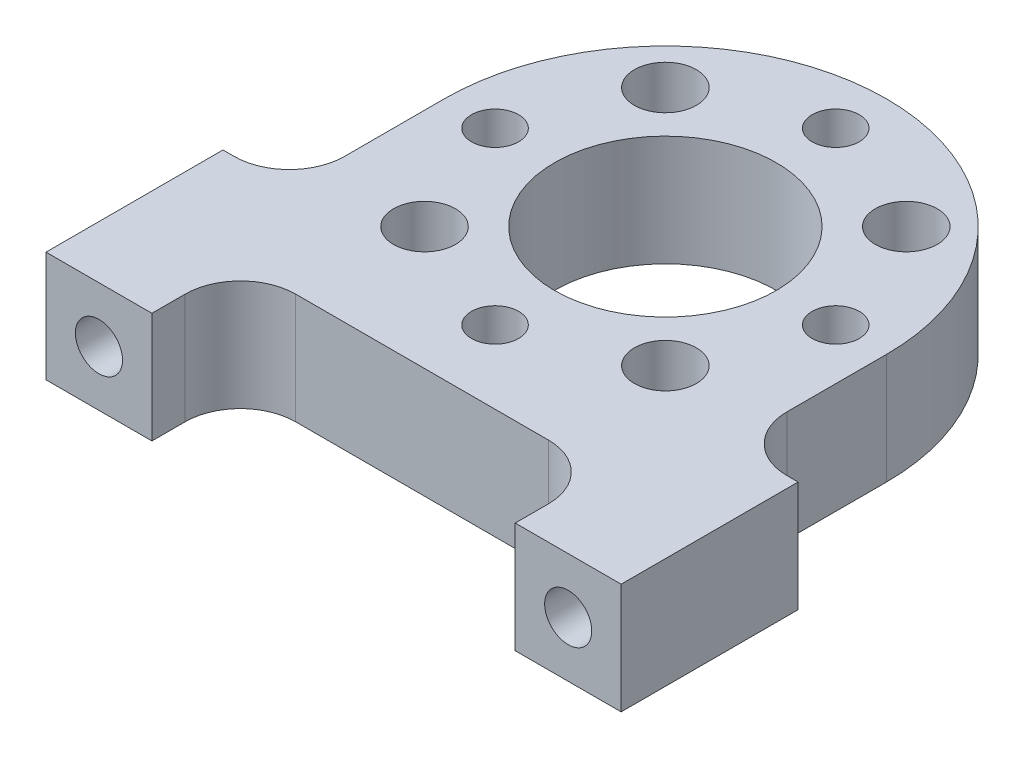
ISO-10303-21;
HEADER;
FILE_DESCRIPTION(('STEP AP214'),'2;1');
FILE_NAME('part.step','',(''),(''),'','','');
FILE_SCHEMA(('AUTOMOTIVE_DESIGN { 1 0 10303 214 1 1 1 1 }'));
ENDSEC;
DATA;
#1=APPLICATION_CONTEXT('core data for automotive mechanical design processes');
#2=APPLICATION_PROTOCOL_DEFINITION('international standard','automotive_design',2000,#1);
#3=PRODUCT_CONTEXT('',#1,'mechanical');
#4=PRODUCT('Part','Part','',(#3));
#5=PRODUCT_RELATED_PRODUCT_CATEGORY('part','',(#4));
#6=PRODUCT_DEFINITION_FORMATION('','',#4);
#7=PRODUCT_DEFINITION_CONTEXT('part definition',#1,'design');
#8=PRODUCT_DEFINITION('design','',#6,#7);
#9=PRODUCT_DEFINITION_SHAPE('','',#8);
#10=(LENGTH_UNIT() NAMED_UNIT(*) SI_UNIT(.MILLI.,.METRE.));
#11=(NAMED_UNIT(*) PLANE_ANGLE_UNIT() SI_UNIT($,.RADIAN.));
#12=(NAMED_UNIT(*) SI_UNIT($,.STERADIAN.) SOLID_ANGLE_UNIT());
#13=UNCERTAINTY_MEASURE_WITH_UNIT(LENGTH_MEASURE(1.E-05),#10,'distance_accuracy_value','');
#14=(GEOMETRIC_REPRESENTATION_CONTEXT(3) GLOBAL_UNCERTAINTY_ASSIGNED_CONTEXT((#13)) GLOBAL_UNIT_ASSIGNED_CONTEXT((#10,
#11,#12)) REPRESENTATION_CONTEXT('',''));
#15=CARTESIAN_POINT('',(0.,0.,0.));
#16=DIRECTION('',(0.,0.,1.));
#17=DIRECTION('',(1.,0.,0.));
#18=AXIS2_PLACEMENT_3D('',#15,#16,#17);
#19=CARTESIAN_POINT('',(-13.4703841816038,3.175,11.429999999848));
#20=DIRECTION('',(0.,0.,1.));
#21=DIRECTION('',(1.,0.,0.));
#22=AXIS2_PLACEMENT_3D('',#19,#20,#21);
#23=CONICAL_SURFACE('',#22,1.35254999978154,1.02974425854162);
#24=CARTESIAN_POINT('',(-13.4703841818293,3.175,10.6173059696459));
#25=VERTEX_POINT('',#24);
#26=VERTEX_LOOP('',#25);
#27=FACE_BOUND('',#26,.T.);
#28=CARTESIAN_POINT('',(-13.4703841816038,3.175,11.43));
#29=DIRECTION('',(0.,0.,1.));
#30=DIRECTION('',(1.,0.,0.));
#31=AXIS2_PLACEMENT_3D('',#28,#29,#30);
#32=CIRCLE('',#31,1.35254999999999);
#33=CARTESIAN_POINT('',(-12.1178341816038,3.175,11.43));
#34=VERTEX_POINT('',#33);
#35=EDGE_CURVE('E250',#34,#34,#32,.T.);
#36=ORIENTED_EDGE('',*,*,#35,.T.);
#37=EDGE_LOOP('',(#36));
#38=FACE_BOUND('',#37,.T.);
#39=ADVANCED_FACE('F26',(#27,#38),#23,.F.);
#40=CARTESIAN_POINT('',(13.4703841816036,3.175,11.4299999999616));
#41=DIRECTION('',(0.,0.,1.));
#42=DIRECTION('',(1.,0.,0.));
#43=AXIS2_PLACEMENT_3D('',#40,#41,#42);
#44=CONICAL_SURFACE('',#43,1.35254999977809,1.02974425839107);
#45=CARTESIAN_POINT('',(13.4703841813462,3.175,10.6173059697028));
#46=VERTEX_POINT('',#45);
#47=VERTEX_LOOP('',#46);
#48=FACE_BOUND('',#47,.T.);
#49=CARTESIAN_POINT('',(13.4703841816036,3.175,11.43));
#50=DIRECTION('',(0.,0.,1.));
#51=DIRECTION('',(1.,0.,0.));
#52=AXIS2_PLACEMENT_3D('',#49,#50,#51);
#53=CIRCLE('',#52,1.35254999999999);
#54=CARTESIAN_POINT('',(14.8229341816036,3.175,11.43));
#55=VERTEX_POINT('',#54);
#56=EDGE_CURVE('E235',#55,#55,#53,.T.);
#57=ORIENTED_EDGE('',*,*,#56,.T.);
#58=EDGE_LOOP('',(#57));
#59=FACE_BOUND('',#58,.T.);
#60=ADVANCED_FACE('F630',(#48,#59),#44,.F.);
#61=CARTESIAN_POINT('',(0.,-38.1211607903012,8.89));
#62=DIRECTION('',(0.,0.,-1.));
#63=DIRECTION('',(-1.,0.,0.));
#64=AXIS2_PLACEMENT_3D('',#61,#62,#63);
#65=PLANE('',#64);
#66=DIRECTION('',(1.,0.,0.));
#67=VECTOR('',#66,1.);
#68=CARTESIAN_POINT('',(0.,0.,8.89));
#69=LINE('',#68,#67);
#70=CARTESIAN_POINT('',(-15.875,0.,8.89));
#71=VERTEX_POINT('',#70);
#72=CARTESIAN_POINT('',(-16.51,0.,8.89));
#73=VERTEX_POINT('',#72);
#74=EDGE_CURVE('E231',#71,#73,#69,.F.);
#75=ORIENTED_EDGE('',*,*,#74,.T.);
#76=DIRECTION('',(0.,1.,0.));
#77=VECTOR('',#76,1.);
#78=CARTESIAN_POINT('',(-16.51,-38.1211607903012,8.89));
#79=LINE('',#78,#77);
#80=CARTESIAN_POINT('',(-16.51,6.35,8.89));
#81=VERTEX_POINT('',#80);
#82=EDGE_CURVE('E212',#81,#73,#79,.F.);
#83=ORIENTED_EDGE('',*,*,#82,.F.);
#84=DIRECTION('',(-1.,0.,0.));
#85=VECTOR('',#84,1.);
#86=CARTESIAN_POINT('',(0.,6.35,8.89));
#87=LINE('',#86,#85);
#88=CARTESIAN_POINT('',(-15.875,6.35,8.89));
#89=VERTEX_POINT('',#88);
#90=EDGE_CURVE('E248',#81,#89,#87,.F.);
#91=ORIENTED_EDGE('',*,*,#90,.T.);
#92=DIRECTION('',(0.,-1.,0.));
#93=VECTOR('',#92,1.);
#94=CARTESIAN_POINT('',(-15.875,-38.1211607903012,8.89));
#95=LINE('',#94,#93);
#96=EDGE_CURVE('E219',#89,#71,#95,.T.);
#97=ORIENTED_EDGE('',*,*,#96,.T.);
#98=EDGE_LOOP('',(#75,#83,#91,#97));
#99=FACE_BOUND('',#98,.T.);
#100=ADVANCED_FACE('F621',(#99),#65,.T.);
#101=CARTESIAN_POINT('',(-13.4703841816038,3.175,19.05));
#102=DIRECTION('',(0.,0.,1.));
#103=DIRECTION('',(1.,0.,0.));
#104=AXIS2_PLACEMENT_3D('',#101,#102,#103);
#105=CYLINDRICAL_SURFACE('',#104,1.35254999999999);
#106=CARTESIAN_POINT('',(-13.4703841816038,3.175,19.05));
#107=DIRECTION('',(0.,0.,1.));
#108=DIRECTION('',(1.,0.,0.));
#109=AXIS2_PLACEMENT_3D('',#106,#107,#108);
#110=CIRCLE('',#109,1.35254999999999);
#111=CARTESIAN_POINT('',(-12.1178341816038,3.175,19.05));
#112=VERTEX_POINT('',#111);
#113=EDGE_CURVE('E215',#112,#112,#110,.F.);
#114=ORIENTED_EDGE('',*,*,#113,.F.);
#115=EDGE_LOOP('',(#114));
#116=FACE_BOUND('',#115,.T.);
#117=ORIENTED_EDGE('',*,*,#35,.F.);
#118=EDGE_LOOP('',(#117));
#119=FACE_BOUND('',#118,.T.);
#120=ADVANCED_FACE('F612',(#116,#119),#105,.F.);
#121=CARTESIAN_POINT('',(13.4703841816036,3.175,19.05));
#122=DIRECTION('',(0.,0.,1.));
#123=DIRECTION('',(1.,0.,0.));
#124=AXIS2_PLACEMENT_3D('',#121,#122,#123);
#125=CYLINDRICAL_SURFACE('',#124,1.35254999999999);
#126=CARTESIAN_POINT('',(13.4703841816036,3.175,19.05));
#127=DIRECTION('',(0.,0.,1.));
#128=DIRECTION('',(1.,0.,0.));
#129=AXIS2_PLACEMENT_3D('',#126,#127,#128);
#130=CIRCLE('',#129,1.35254999999999);
#131=CARTESIAN_POINT('',(14.8229341816036,3.175,19.05));
#132=VERTEX_POINT('',#131);
#133=EDGE_CURVE('E239',#132,#132,#130,.F.);
#134=ORIENTED_EDGE('',*,*,#133,.F.);
#135=EDGE_LOOP('',(#134));
#136=FACE_BOUND('',#135,.T.);
#137=ORIENTED_EDGE('',*,*,#56,.F.);
#138=EDGE_LOOP('',(#137));
#139=FACE_BOUND('',#138,.T.);
#140=ADVANCED_FACE('F603',(#136,#139),#125,.F.);
#141=CARTESIAN_POINT('',(0.,-38.1211607903012,8.89));
#142=DIRECTION('',(0.,0.,-1.));
#143=DIRECTION('',(-1.,0.,0.));
#144=AXIS2_PLACEMENT_3D('',#141,#142,#143);
#145=PLANE('',#144);
#146=DIRECTION('',(-1.,0.,0.));
#147=VECTOR('',#146,1.);
#148=CARTESIAN_POINT('',(0.,6.35,8.89));
#149=LINE('',#148,#147);
#150=CARTESIAN_POINT('',(15.875,6.35,8.89));
#151=VERTEX_POINT('',#150);
#152=CARTESIAN_POINT('',(16.51,6.35,8.89));
#153=VERTEX_POINT('',#152);
#154=EDGE_CURVE('E233',#151,#153,#149,.F.);
#155=ORIENTED_EDGE('',*,*,#154,.T.);
#156=DIRECTION('',(0.,1.,0.));
#157=VECTOR('',#156,1.);
#158=CARTESIAN_POINT('',(16.51,-38.1211607903012,8.89));
#159=LINE('',#158,#157);
#160=CARTESIAN_POINT('',(16.51,0.,8.89));
#161=VERTEX_POINT('',#160);
#162=EDGE_CURVE('E161',#161,#153,#159,.T.);
#163=ORIENTED_EDGE('',*,*,#162,.F.);
#164=DIRECTION('',(1.,0.,0.));
#165=VECTOR('',#164,1.);
#166=CARTESIAN_POINT('',(0.,0.,8.89));
#167=LINE('',#166,#165);
#168=CARTESIAN_POINT('',(15.875,0.,8.89));
#169=VERTEX_POINT('',#168);
#170=EDGE_CURVE('E229',#161,#169,#167,.F.);
#171=ORIENTED_EDGE('',*,*,#170,.T.);
#172=DIRECTION('',(0.,-1.,0.));
#173=VECTOR('',#172,1.);
#174=CARTESIAN_POINT('',(15.875,-38.1211607903012,8.89));
#175=LINE('',#174,#173);
#176=EDGE_CURVE('E160',#169,#151,#175,.F.);
#177=ORIENTED_EDGE('',*,*,#176,.T.);
#178=EDGE_LOOP('',(#155,#163,#171,#177));
#179=FACE_BOUND('',#178,.T.);
#180=ADVANCED_FACE('F351',(#179),#145,.T.);
#181=CARTESIAN_POINT('',(0.,0.,0.));
#182=DIRECTION('',(0.,1.,0.));
#183=DIRECTION('',(0.,0.,1.));
#184=AXIS2_PLACEMENT_3D('',#181,#182,#183);
#185=PLANE('',#184);
#186=DIRECTION('',(0.,0.,-1.));
#187=VECTOR('',#186,1.);
#188=CARTESIAN_POINT('',(12.7,0.,0.));
#189=LINE('',#188,#187);
#190=CARTESIAN_POINT('',(12.7,0.,5.715));
#191=VERTEX_POINT('',#190);
#192=CARTESIAN_POINT('',(12.7,0.,0.));
#193=VERTEX_POINT('',#192);
#194=EDGE_CURVE('E225',#191,#193,#189,.T.);
#195=ORIENTED_EDGE('',*,*,#194,.F.);
#196=CARTESIAN_POINT('',(15.875,0.,5.715));
#197=DIRECTION('',(0.,-1.,0.));
#198=DIRECTION('',(0.,0.,-1.));
#199=AXIS2_PLACEMENT_3D('',#196,#197,#198);
#200=CIRCLE('',#199,3.175);
#201=EDGE_CURVE('E296',#191,#169,#200,.F.);
#202=ORIENTED_EDGE('',*,*,#201,.T.);
#203=ORIENTED_EDGE('',*,*,#170,.F.);
#204=DIRECTION('',(0.,0.,-1.));
#205=VECTOR('',#204,1.);
#206=CARTESIAN_POINT('',(16.51,0.,0.));
#207=LINE('',#206,#205);
#208=CARTESIAN_POINT('',(16.51,0.,19.05));
#209=VERTEX_POINT('',#208);
#210=EDGE_CURVE('E185',#209,#161,#207,.T.);
#211=ORIENTED_EDGE('',*,*,#210,.F.);
#212=DIRECTION('',(1.,0.,0.));
#213=VECTOR('',#212,1.);
#214=CARTESIAN_POINT('',(0.,0.,19.05));
#215=LINE('',#214,#213);
#216=CARTESIAN_POINT('',(10.42924,0.,19.05));
#217=VERTEX_POINT('',#216);
#218=EDGE_CURVE('E157',#217,#209,#215,.T.);
#219=ORIENTED_EDGE('',*,*,#218,.F.);
#220=DIRECTION('',(0.,0.,1.));
#221=VECTOR('',#220,1.);
#222=CARTESIAN_POINT('',(10.42924,0.,0.));
#223=LINE('',#222,#221);
#224=CARTESIAN_POINT('',(10.42924,0.,17.145));
#225=VERTEX_POINT('',#224);
#226=EDGE_CURVE('E236',#225,#217,#223,.T.);
#227=ORIENTED_EDGE('',*,*,#226,.F.);
#228=CARTESIAN_POINT('',(7.25424,0.,17.145));
#229=DIRECTION('',(0.,-1.,0.));
#230=DIRECTION('',(0.,0.,-1.));
#231=AXIS2_PLACEMENT_3D('',#228,#229,#230);
#232=CIRCLE('',#231,3.175);
#233=CARTESIAN_POINT('',(7.25424,0.,13.97));
#234=VERTEX_POINT('',#233);
#235=EDGE_CURVE('E188',#225,#234,#232,.F.);
#236=ORIENTED_EDGE('',*,*,#235,.T.);
#237=DIRECTION('',(1.,0.,0.));
#238=VECTOR('',#237,1.);
#239=CARTESIAN_POINT('',(0.,0.,13.97));
#240=LINE('',#239,#238);
#241=CARTESIAN_POINT('',(-7.25424,0.,13.97));
#242=VERTEX_POINT('',#241);
#243=EDGE_CURVE('E192',#242,#234,#240,.T.);
#244=ORIENTED_EDGE('',*,*,#243,.F.);
#245=CARTESIAN_POINT('',(-7.25424,0.,17.145));
#246=DIRECTION('',(0.,-1.,0.));
#247=DIRECTION('',(0.,0.,-1.));
#248=AXIS2_PLACEMENT_3D('',#245,#246,#247);
#249=CIRCLE('',#248,3.175);
#250=CARTESIAN_POINT('',(-10.42924,0.,17.145));
#251=VERTEX_POINT('',#250);
#252=EDGE_CURVE('E195',#242,#251,#249,.F.);
#253=ORIENTED_EDGE('',*,*,#252,.T.);
#254=DIRECTION('',(0.,0.,-1.));
#255=VECTOR('',#254,1.);
#256=CARTESIAN_POINT('',(-10.42924,0.,0.));
#257=LINE('',#256,#255);
#258=CARTESIAN_POINT('',(-10.42924,0.,19.05));
#259=VERTEX_POINT('',#258);
#260=EDGE_CURVE('E199',#259,#251,#257,.T.);
#261=ORIENTED_EDGE('',*,*,#260,.F.);
#262=DIRECTION('',(1.,0.,0.));
#263=VECTOR('',#262,1.);
#264=CARTESIAN_POINT('',(0.,0.,19.05));
#265=LINE('',#264,#263);
#266=CARTESIAN_POINT('',(-16.51,0.,19.05));
#267=VERTEX_POINT('',#266);
#268=EDGE_CURVE('E208',#267,#259,#265,.T.);
#269=ORIENTED_EDGE('',*,*,#268,.F.);
#270=DIRECTION('',(0.,0.,1.));
#271=VECTOR('',#270,1.);
#272=CARTESIAN_POINT('',(-16.51,0.,0.));
#273=LINE('',#272,#271);
#274=EDGE_CURVE('E216',#73,#267,#273,.T.);
#275=ORIENTED_EDGE('',*,*,#274,.F.);
#276=ORIENTED_EDGE('',*,*,#74,.F.);
#277=CARTESIAN_POINT('',(-15.875,0.,5.715));
#278=DIRECTION('',(0.,-1.,0.));
#279=DIRECTION('',(0.,0.,-1.));
#280=AXIS2_PLACEMENT_3D('',#277,#278,#279);
#281=CIRCLE('',#280,3.175);
#282=CARTESIAN_POINT('',(-12.7,0.,5.715));
#283=VERTEX_POINT('',#282);
#284=EDGE_CURVE('E222',#71,#283,#281,.F.);
#285=ORIENTED_EDGE('',*,*,#284,.T.);
#286=DIRECTION('',(0.,0.,1.));
#287=VECTOR('',#286,1.);
#288=CARTESIAN_POINT('',(-12.7,0.,0.));
#289=LINE('',#288,#287);
#290=CARTESIAN_POINT('',(-12.7,0.,0.));
#291=VERTEX_POINT('',#290);
#292=EDGE_CURVE('E110',#291,#283,#289,.T.);
#293=ORIENTED_EDGE('',*,*,#292,.F.);
#294=CARTESIAN_POINT('',(0.,0.,0.));
#295=DIRECTION('',(0.,-1.,0.));
#296=DIRECTION('',(0.,0.,-1.));
#297=AXIS2_PLACEMENT_3D('',#294,#295,#296);
#298=CIRCLE('',#297,12.7);
#299=EDGE_CURVE('E252',#193,#291,#298,.F.);
#300=ORIENTED_EDGE('',*,*,#299,.F.);
#301=EDGE_LOOP('',(#195,#202,#203,#211,#219,#227,#236,#244,#253,#261,#269,#275,#276,#285,#293,#300));
#302=FACE_BOUND('',#301,.T.);
#303=CARTESIAN_POINT('',(0.,0.,0.));
#304=DIRECTION('',(0.,1.,0.));
#305=DIRECTION('',(0.,0.,1.));
#306=AXIS2_PLACEMENT_3D('',#303,#304,#305);
#307=CIRCLE('',#306,6.3627);
#308=CARTESIAN_POINT('',(0.,0.,6.3627));
#309=VERTEX_POINT('',#308);
#310=EDGE_CURVE('E309',#309,#309,#307,.T.);
#311=ORIENTED_EDGE('',*,*,#310,.T.);
#312=EDGE_LOOP('',(#311));
#313=FACE_BOUND('',#312,.T.);
#314=CARTESIAN_POINT('',(9.779,0.,0.));
#315=DIRECTION('',(0.,1.,0.));
#316=DIRECTION('',(0.,0.,1.));
#317=AXIS2_PLACEMENT_3D('',#314,#315,#316);
#318=CIRCLE('',#317,1.35254999999999);
#319=CARTESIAN_POINT('',(9.779,0.,1.35254999999999));
#320=VERTEX_POINT('',#319);
#321=EDGE_CURVE('E312',#320,#320,#318,.T.);
#322=ORIENTED_EDGE('',*,*,#321,.T.);
#323=EDGE_LOOP('',(#322));
#324=FACE_BOUND('',#323,.T.);
#325=CARTESIAN_POINT('',(0.,0.,-9.779));
#326=DIRECTION('',(0.,1.,0.));
#327=DIRECTION('',(0.,0.,1.));
#328=AXIS2_PLACEMENT_3D('',#325,#326,#327);
#329=CIRCLE('',#328,1.35254999999999);
#330=CARTESIAN_POINT('',(0.,0.,-8.42645000000001));
#331=VERTEX_POINT('',#330);
#332=EDGE_CURVE('E315',#331,#331,#329,.T.);
#333=ORIENTED_EDGE('',*,*,#332,.T.);
#334=EDGE_LOOP('',(#333));
#335=FACE_BOUND('',#334,.T.);
#336=CARTESIAN_POINT('',(-9.779,0.,0.));
#337=DIRECTION('',(0.,1.,0.));
#338=DIRECTION('',(0.,0.,1.));
#339=AXIS2_PLACEMENT_3D('',#336,#337,#338);
#340=CIRCLE('',#339,1.35254999999999);
#341=CARTESIAN_POINT('',(-9.779,0.,1.35254999999999));
#342=VERTEX_POINT('',#341);
#343=EDGE_CURVE('E318',#342,#342,#340,.T.);
#344=ORIENTED_EDGE('',*,*,#343,.T.);
#345=EDGE_LOOP('',(#344));
#346=FACE_BOUND('',#345,.T.);
#347=CARTESIAN_POINT('',(1.02429588037641E-13,0.,9.779));
#348=DIRECTION('',(0.,1.,0.));
#349=DIRECTION('',(0.,0.,1.));
#350=AXIS2_PLACEMENT_3D('',#347,#348,#349);
#351=CIRCLE('',#350,1.35254999999999);
#352=CARTESIAN_POINT('',(1.02429588037641E-13,0.,11.13155));
#353=VERTEX_POINT('',#352);
#354=EDGE_CURVE('E321',#353,#353,#351,.T.);
#355=ORIENTED_EDGE('',*,*,#354,.T.);
#356=EDGE_LOOP('',(#355));
#357=FACE_BOUND('',#356,.T.);
#358=CARTESIAN_POINT('',(6.91479721322319,0.,-6.9147972132233));
#359=DIRECTION('',(0.,1.,0.));
#360=DIRECTION('',(0.,0.,1.));
#361=AXIS2_PLACEMENT_3D('',#358,#359,#360);
#362=CIRCLE('',#361,1.778);
#363=CARTESIAN_POINT('',(6.91479721322319,0.,-5.1367972132233));
#364=VERTEX_POINT('',#363);
#365=EDGE_CURVE('E324',#364,#364,#362,.T.);
#366=ORIENTED_EDGE('',*,*,#365,.T.);
#367=EDGE_LOOP('',(#366));
#368=FACE_BOUND('',#367,.T.);
#369=CARTESIAN_POINT('',(-6.91479721322332,0.,-6.91479721322317));
#370=DIRECTION('',(0.,1.,0.));
#371=DIRECTION('',(0.,0.,1.));
#372=AXIS2_PLACEMENT_3D('',#369,#370,#371);
#373=CIRCLE('',#372,1.778);
#374=CARTESIAN_POINT('',(-6.91479721322332,0.,-5.13679721322317));
#375=VERTEX_POINT('',#374);
#376=EDGE_CURVE('E327',#375,#375,#373,.T.);
#377=ORIENTED_EDGE('',*,*,#376,.T.);
#378=EDGE_LOOP('',(#377));
#379=FACE_BOUND('',#378,.T.);
#380=CARTESIAN_POINT('',(-6.91479721322319,0.,6.9147972132233));
#381=DIRECTION('',(0.,1.,0.));
#382=DIRECTION('',(0.,0.,1.));
#383=AXIS2_PLACEMENT_3D('',#380,#381,#382);
#384=CIRCLE('',#383,1.778);
#385=CARTESIAN_POINT('',(-6.91479721322319,0.,8.6927972132233));
#386=VERTEX_POINT('',#385);
#387=EDGE_CURVE('E329',#386,#386,#384,.T.);
#388=ORIENTED_EDGE('',*,*,#387,.T.);
#389=EDGE_LOOP('',(#388));
#390=FACE_BOUND('',#389,.T.);
#391=CARTESIAN_POINT('',(6.91479721322337,0.,6.91479721322312));
#392=DIRECTION('',(0.,1.,0.));
#393=DIRECTION('',(0.,0.,1.));
#394=AXIS2_PLACEMENT_3D('',#391,#392,#393);
#395=CIRCLE('',#394,1.778);
#396=CARTESIAN_POINT('',(6.91479721322337,0.,8.69279721322311));
#397=VERTEX_POINT('',#396);
#398=EDGE_CURVE('E29',#397,#397,#395,.T.);
#399=ORIENTED_EDGE('',*,*,#398,.T.);
#400=EDGE_LOOP('',(#399));
#401=FACE_BOUND('',#400,.T.);
#402=ADVANCED_FACE('F336',(#302,#313,#324,#335,#346,#357,#368,#379,#390,#401),#185,.F.);
#403=CARTESIAN_POINT('',(6.91479721322337,6.35,6.91479721322312));
#404=DIRECTION('',(0.,1.,0.));
#405=DIRECTION('',(0.,0.,1.));
#406=AXIS2_PLACEMENT_3D('',#403,#404,#405);
#407=CYLINDRICAL_SURFACE('',#406,1.778);
#408=CARTESIAN_POINT('',(6.91479721322337,6.35,6.91479721322312));
#409=DIRECTION('',(0.,1.,0.));
#410=DIRECTION('',(0.,0.,1.));
#411=AXIS2_PLACEMENT_3D('',#408,#409,#410);
#412=CIRCLE('',#411,1.778);
#413=CARTESIAN_POINT('',(6.91479721322337,6.35,8.69279721322311));
#414=VERTEX_POINT('',#413);
#415=EDGE_CURVE('E293',#414,#414,#412,.F.);
#416=ORIENTED_EDGE('',*,*,#415,.F.);
#417=EDGE_LOOP('',(#416));
#418=FACE_BOUND('',#417,.T.);
#419=ORIENTED_EDGE('',*,*,#398,.F.);
#420=EDGE_LOOP('',(#419));
#421=FACE_BOUND('',#420,.T.);
#422=ADVANCED_FACE('F338',(#418,#421),#407,.F.);
#423=CARTESIAN_POINT('',(-6.91479721322319,6.35,6.9147972132233));
#424=DIRECTION('',(0.,1.,0.));
#425=DIRECTION('',(0.,0.,1.));
#426=AXIS2_PLACEMENT_3D('',#423,#424,#425);
#427=CYLINDRICAL_SURFACE('',#426,1.778);
#428=CARTESIAN_POINT('',(-6.91479721322319,6.35,6.9147972132233));
#429=DIRECTION('',(0.,1.,0.));
#430=DIRECTION('',(0.,0.,1.));
#431=AXIS2_PLACEMENT_3D('',#428,#429,#430);
#432=CIRCLE('',#431,1.778);
#433=CARTESIAN_POINT('',(-6.91479721322319,6.35,8.6927972132233));
#434=VERTEX_POINT('',#433);
#435=EDGE_CURVE('E290',#434,#434,#432,.F.);
#436=ORIENTED_EDGE('',*,*,#435,.F.);
#437=EDGE_LOOP('',(#436));
#438=FACE_BOUND('',#437,.T.);
#439=ORIENTED_EDGE('',*,*,#387,.F.);
#440=EDGE_LOOP('',(#439));
#441=FACE_BOUND('',#440,.T.);
#442=ADVANCED_FACE('F340',(#438,#441),#427,.F.);
#443=CARTESIAN_POINT('',(-6.91479721322332,6.35,-6.91479721322317));
#444=DIRECTION('',(0.,1.,0.));
#445=DIRECTION('',(0.,0.,1.));
#446=AXIS2_PLACEMENT_3D('',#443,#444,#445);
#447=CYLINDRICAL_SURFACE('',#446,1.778);
#448=CARTESIAN_POINT('',(-6.91479721322332,6.35,-6.91479721322317));
#449=DIRECTION('',(0.,1.,0.));
#450=DIRECTION('',(0.,0.,1.));
#451=AXIS2_PLACEMENT_3D('',#448,#449,#450);
#452=CIRCLE('',#451,1.778);
#453=CARTESIAN_POINT('',(-6.91479721322332,6.35,-5.13679721322317));
#454=VERTEX_POINT('',#453);
#455=EDGE_CURVE('E287',#454,#454,#452,.F.);
#456=ORIENTED_EDGE('',*,*,#455,.F.);
#457=EDGE_LOOP('',(#456));
#458=FACE_BOUND('',#457,.T.);
#459=ORIENTED_EDGE('',*,*,#376,.F.);
#460=EDGE_LOOP('',(#459));
#461=FACE_BOUND('',#460,.T.);
#462=ADVANCED_FACE('F348',(#458,#461),#447,.F.);
#463=CARTESIAN_POINT('',(6.91479721322319,6.35,-6.9147972132233));
#464=DIRECTION('',(0.,1.,0.));
#465=DIRECTION('',(0.,0.,1.));
#466=AXIS2_PLACEMENT_3D('',#463,#464,#465);
#467=CYLINDRICAL_SURFACE('',#466,1.778);
#468=CARTESIAN_POINT('',(6.91479721322319,6.35,-6.9147972132233));
#469=DIRECTION('',(0.,1.,0.));
#470=DIRECTION('',(0.,0.,1.));
#471=AXIS2_PLACEMENT_3D('',#468,#469,#470);
#472=CIRCLE('',#471,1.778);
#473=CARTESIAN_POINT('',(6.91479721322319,6.35,-5.1367972132233));
#474=VERTEX_POINT('',#473);
#475=EDGE_CURVE('E284',#474,#474,#472,.F.);
#476=ORIENTED_EDGE('',*,*,#475,.F.);
#477=EDGE_LOOP('',(#476));
#478=FACE_BOUND('',#477,.T.);
#479=ORIENTED_EDGE('',*,*,#365,.F.);
#480=EDGE_LOOP('',(#479));
#481=FACE_BOUND('',#480,.T.);
#482=ADVANCED_FACE('F429',(#478,#481),#467,.F.);
#483=CARTESIAN_POINT('',(1.02429588037641E-13,6.35,9.779));
#484=DIRECTION('',(0.,1.,0.));
#485=DIRECTION('',(0.,0.,1.));
#486=AXIS2_PLACEMENT_3D('',#483,#484,#485);
#487=CYLINDRICAL_SURFACE('',#486,1.35254999999999);
#488=CARTESIAN_POINT('',(1.02429588037641E-13,6.35,9.779));
#489=DIRECTION('',(0.,1.,0.));
#490=DIRECTION('',(0.,0.,1.));
#491=AXIS2_PLACEMENT_3D('',#488,#489,#490);
#492=CIRCLE('',#491,1.35254999999999);
#493=CARTESIAN_POINT('',(1.02429588037641E-13,6.35,11.13155));
#494=VERTEX_POINT('',#493);
#495=EDGE_CURVE('E281',#494,#494,#492,.F.);
#496=ORIENTED_EDGE('',*,*,#495,.F.);
#497=EDGE_LOOP('',(#496));
#498=FACE_BOUND('',#497,.T.);
#499=ORIENTED_EDGE('',*,*,#354,.F.);
#500=EDGE_LOOP('',(#499));
#501=FACE_BOUND('',#500,.T.);
#502=ADVANCED_FACE('F425',(#498,#501),#487,.F.);
#503=CARTESIAN_POINT('',(-9.779,6.35,0.));
#504=DIRECTION('',(0.,1.,0.));
#505=DIRECTION('',(0.,0.,1.));
#506=AXIS2_PLACEMENT_3D('',#503,#504,#505);
#507=CYLINDRICAL_SURFACE('',#506,1.35254999999999);
#508=CARTESIAN_POINT('',(-9.779,6.35,0.));
#509=DIRECTION('',(0.,1.,0.));
#510=DIRECTION('',(0.,0.,1.));
#511=AXIS2_PLACEMENT_3D('',#508,#509,#510);
#512=CIRCLE('',#511,1.35254999999999);
#513=CARTESIAN_POINT('',(-9.779,6.35,1.35254999999999));
#514=VERTEX_POINT('',#513);
#515=EDGE_CURVE('E278',#514,#514,#512,.F.);
#516=ORIENTED_EDGE('',*,*,#515,.F.);
#517=EDGE_LOOP('',(#516));
#518=FACE_BOUND('',#517,.T.);
#519=ORIENTED_EDGE('',*,*,#343,.F.);
#520=EDGE_LOOP('',(#519));
#521=FACE_BOUND('',#520,.T.);
#522=ADVANCED_FACE('F421',(#518,#521),#507,.F.);
#523=CARTESIAN_POINT('',(0.,6.35,-9.779));
#524=DIRECTION('',(0.,1.,0.));
#525=DIRECTION('',(0.,0.,1.));
#526=AXIS2_PLACEMENT_3D('',#523,#524,#525);
#527=CYLINDRICAL_SURFACE('',#526,1.35254999999999);
#528=CARTESIAN_POINT('',(0.,6.35,-9.779));
#529=DIRECTION('',(0.,1.,0.));
#530=DIRECTION('',(0.,0.,1.));
#531=AXIS2_PLACEMENT_3D('',#528,#529,#530);
#532=CIRCLE('',#531,1.35254999999999);
#533=CARTESIAN_POINT('',(0.,6.35,-8.42645000000001));
#534=VERTEX_POINT('',#533);
#535=EDGE_CURVE('E275',#534,#534,#532,.F.);
#536=ORIENTED_EDGE('',*,*,#535,.F.);
#537=EDGE_LOOP('',(#536));
#538=FACE_BOUND('',#537,.T.);
#539=ORIENTED_EDGE('',*,*,#332,.F.);
#540=EDGE_LOOP('',(#539));
#541=FACE_BOUND('',#540,.T.);
#542=ADVANCED_FACE('F417',(#538,#541),#527,.F.);
#543=CARTESIAN_POINT('',(9.779,6.35,0.));
#544=DIRECTION('',(0.,1.,0.));
#545=DIRECTION('',(0.,0.,1.));
#546=AXIS2_PLACEMENT_3D('',#543,#544,#545);
#547=CYLINDRICAL_SURFACE('',#546,1.35254999999999);
#548=CARTESIAN_POINT('',(9.779,6.35,0.));
#549=DIRECTION('',(0.,1.,0.));
#550=DIRECTION('',(0.,0.,1.));
#551=AXIS2_PLACEMENT_3D('',#548,#549,#550);
#552=CIRCLE('',#551,1.35254999999999);
#553=CARTESIAN_POINT('',(9.779,6.35,1.35254999999999));
#554=VERTEX_POINT('',#553);
#555=EDGE_CURVE('E272',#554,#554,#552,.F.);
#556=ORIENTED_EDGE('',*,*,#555,.F.);
#557=EDGE_LOOP('',(#556));
#558=FACE_BOUND('',#557,.T.);
#559=ORIENTED_EDGE('',*,*,#321,.F.);
#560=EDGE_LOOP('',(#559));
#561=FACE_BOUND('',#560,.T.);
#562=ADVANCED_FACE('F413',(#558,#561),#547,.F.);
#563=CARTESIAN_POINT('',(0.,6.35,0.));
#564=DIRECTION('',(0.,1.,0.));
#565=DIRECTION('',(0.,0.,1.));
#566=AXIS2_PLACEMENT_3D('',#563,#564,#565);
#567=CYLINDRICAL_SURFACE('',#566,6.3627);
#568=CARTESIAN_POINT('',(0.,6.35,0.));
#569=DIRECTION('',(0.,1.,0.));
#570=DIRECTION('',(0.,0.,1.));
#571=AXIS2_PLACEMENT_3D('',#568,#569,#570);
#572=CIRCLE('',#571,6.3627);
#573=CARTESIAN_POINT('',(0.,6.35,6.3627));
#574=VERTEX_POINT('',#573);
#575=EDGE_CURVE('E269',#574,#574,#572,.F.);
#576=ORIENTED_EDGE('',*,*,#575,.F.);
#577=EDGE_LOOP('',(#576));
#578=FACE_BOUND('',#577,.T.);
#579=ORIENTED_EDGE('',*,*,#310,.F.);
#580=EDGE_LOOP('',(#579));
#581=FACE_BOUND('',#580,.T.);
#582=ADVANCED_FACE('F409',(#578,#581),#567,.F.);
#583=CARTESIAN_POINT('',(0.,6.35,0.));
#584=DIRECTION('',(0.,-1.,0.));
#585=DIRECTION('',(0.,0.,-1.));
#586=AXIS2_PLACEMENT_3D('',#583,#584,#585);
#587=CYLINDRICAL_SURFACE('',#586,12.7);
#588=ORIENTED_EDGE('',*,*,#299,.T.);
#589=DIRECTION('',(0.,1.,0.));
#590=VECTOR('',#589,1.);
#591=CARTESIAN_POINT('',(-12.7,-38.1211607903012,0.));
#592=LINE('',#591,#590);
#593=CARTESIAN_POINT('',(-12.7,6.35,0.));
#594=VERTEX_POINT('',#593);
#595=EDGE_CURVE('E220',#594,#291,#592,.F.);
#596=ORIENTED_EDGE('',*,*,#595,.F.);
#597=CARTESIAN_POINT('',(0.,6.35,0.));
#598=DIRECTION('',(0.,-1.,0.));
#599=DIRECTION('',(0.,0.,-1.));
#600=AXIS2_PLACEMENT_3D('',#597,#598,#599);
#601=CIRCLE('',#600,12.7);
#602=CARTESIAN_POINT('',(12.7,6.35,0.));
#603=VERTEX_POINT('',#602);
#604=EDGE_CURVE('E267',#603,#594,#601,.F.);
#605=ORIENTED_EDGE('',*,*,#604,.F.);
#606=DIRECTION('',(0.,1.,0.));
#607=VECTOR('',#606,1.);
#608=CARTESIAN_POINT('',(12.7,-38.1211607903012,0.));
#609=LINE('',#608,#607);
#610=EDGE_CURVE('E228',#193,#603,#609,.T.);
#611=ORIENTED_EDGE('',*,*,#610,.F.);
#612=EDGE_LOOP('',(#588,#596,#605,#611));
#613=FACE_BOUND('',#612,.T.);
#614=ADVANCED_FACE('F405',(#613),#587,.T.);
#615=CARTESIAN_POINT('',(-12.7,-38.1211607903012,0.));
#616=DIRECTION('',(-1.,0.,0.));
#617=DIRECTION('',(0.,0.,1.));
#618=AXIS2_PLACEMENT_3D('',#615,#616,#617);
#619=PLANE('',#618);
#620=DIRECTION('',(0.,0.,1.));
#621=VECTOR('',#620,1.);
#622=CARTESIAN_POINT('',(-12.7,6.35,0.));
#623=LINE('',#622,#621);
#624=CARTESIAN_POINT('',(-12.7,6.35,5.715));
#625=VERTEX_POINT('',#624);
#626=EDGE_CURVE('E266',#594,#625,#623,.T.);
#627=ORIENTED_EDGE('',*,*,#626,.F.);
#628=ORIENTED_EDGE('',*,*,#595,.T.);
#629=ORIENTED_EDGE('',*,*,#292,.T.);
#630=DIRECTION('',(0.,-1.,0.));
#631=VECTOR('',#630,1.);
#632=CARTESIAN_POINT('',(-12.7,-38.1211607903012,5.715));
#633=LINE('',#632,#631);
#634=EDGE_CURVE('E217',#283,#625,#633,.F.);
#635=ORIENTED_EDGE('',*,*,#634,.T.);
#636=EDGE_LOOP('',(#627,#628,#629,#635));
#637=FACE_BOUND('',#636,.T.);
#638=ADVANCED_FACE('F401',(#637),#619,.T.);
#639=CARTESIAN_POINT('',(-15.875,-38.1211607903012,5.715));
#640=DIRECTION('',(0.,-1.,0.));
#641=DIRECTION('',(0.,0.,-1.));
#642=AXIS2_PLACEMENT_3D('',#639,#640,#641);
#643=CYLINDRICAL_SURFACE('',#642,3.175);
#644=ORIENTED_EDGE('',*,*,#96,.F.);
#645=CARTESIAN_POINT('',(-15.875,6.35,5.715));
#646=DIRECTION('',(0.,-1.,0.));
#647=DIRECTION('',(0.,0.,-1.));
#648=AXIS2_PLACEMENT_3D('',#645,#646,#647);
#649=CIRCLE('',#648,3.175);
#650=EDGE_CURVE('E211',#625,#89,#649,.T.);
#651=ORIENTED_EDGE('',*,*,#650,.F.);
#652=ORIENTED_EDGE('',*,*,#634,.F.);
#653=ORIENTED_EDGE('',*,*,#284,.F.);
#654=EDGE_LOOP('',(#644,#651,#652,#653));
#655=FACE_BOUND('',#654,.T.);
#656=ADVANCED_FACE('F397',(#655),#643,.F.);
#657=CARTESIAN_POINT('',(-16.51,-38.1211607903012,0.));
#658=DIRECTION('',(-1.,0.,0.));
#659=DIRECTION('',(0.,0.,1.));
#660=AXIS2_PLACEMENT_3D('',#657,#658,#659);
#661=PLANE('',#660);
#662=DIRECTION('',(0.,0.,1.));
#663=VECTOR('',#662,1.);
#664=CARTESIAN_POINT('',(-16.51,6.35,0.));
#665=LINE('',#664,#663);
#666=CARTESIAN_POINT('',(-16.51,6.35,19.05));
#667=VERTEX_POINT('',#666);
#668=EDGE_CURVE('E204',#81,#667,#665,.T.);
#669=ORIENTED_EDGE('',*,*,#668,.F.);
#670=ORIENTED_EDGE('',*,*,#82,.T.);
#671=ORIENTED_EDGE('',*,*,#274,.T.);
#672=DIRECTION('',(0.,1.,0.));
#673=VECTOR('',#672,1.);
#674=CARTESIAN_POINT('',(-16.51,-38.1211607903012,19.05));
#675=LINE('',#674,#673);
#676=EDGE_CURVE('E205',#667,#267,#675,.F.);
#677=ORIENTED_EDGE('',*,*,#676,.F.);
#678=EDGE_LOOP('',(#669,#670,#671,#677));
#679=FACE_BOUND('',#678,.T.);
#680=ADVANCED_FACE('F393',(#679),#661,.T.);
#681=CARTESIAN_POINT('',(0.,-38.1211607903012,19.05));
#682=DIRECTION('',(0.,0.,1.));
#683=DIRECTION('',(1.,0.,0.));
#684=AXIS2_PLACEMENT_3D('',#681,#682,#683);
#685=PLANE('',#684);
#686=DIRECTION('',(1.,0.,0.));
#687=VECTOR('',#686,1.);
#688=CARTESIAN_POINT('',(0.,6.35,19.05));
#689=LINE('',#688,#687);
#690=CARTESIAN_POINT('',(-10.42924,6.35,19.05));
#691=VERTEX_POINT('',#690);
#692=EDGE_CURVE('E200',#667,#691,#689,.T.);
#693=ORIENTED_EDGE('',*,*,#692,.F.);
#694=ORIENTED_EDGE('',*,*,#676,.T.);
#695=ORIENTED_EDGE('',*,*,#268,.T.);
#696=DIRECTION('',(0.,1.,0.));
#697=VECTOR('',#696,1.);
#698=CARTESIAN_POINT('',(-10.42924,-38.1211607903012,19.05));
#699=LINE('',#698,#697);
#700=EDGE_CURVE('E196',#691,#259,#699,.F.);
#701=ORIENTED_EDGE('',*,*,#700,.F.);
#702=EDGE_LOOP('',(#693,#694,#695,#701));
#703=FACE_BOUND('',#702,.T.);
#704=ORIENTED_EDGE('',*,*,#113,.T.);
#705=EDGE_LOOP('',(#704));
#706=FACE_BOUND('',#705,.T.);
#707=ADVANCED_FACE('F389',(#703,#706),#685,.T.);
#708=CARTESIAN_POINT('',(-10.42924,-38.1211607903012,0.));
#709=DIRECTION('',(1.,0.,0.));
#710=DIRECTION('',(0.,0.,-1.));
#711=AXIS2_PLACEMENT_3D('',#708,#709,#710);
#712=PLANE('',#711);
#713=DIRECTION('',(0.,0.,1.));
#714=VECTOR('',#713,1.);
#715=CARTESIAN_POINT('',(-10.42924,6.35,0.));
#716=LINE('',#715,#714);
#717=CARTESIAN_POINT('',(-10.42924,6.35,17.145));
#718=VERTEX_POINT('',#717);
#719=EDGE_CURVE('E203',#691,#718,#716,.F.);
#720=ORIENTED_EDGE('',*,*,#719,.F.);
#721=ORIENTED_EDGE('',*,*,#700,.T.);
#722=ORIENTED_EDGE('',*,*,#260,.T.);
#723=DIRECTION('',(0.,-1.,0.));
#724=VECTOR('',#723,1.);
#725=CARTESIAN_POINT('',(-10.42924,-38.1211607903012,17.145));
#726=LINE('',#725,#724);
#727=EDGE_CURVE('E193',#251,#718,#726,.F.);
#728=ORIENTED_EDGE('',*,*,#727,.T.);
#729=EDGE_LOOP('',(#720,#721,#722,#728));
#730=FACE_BOUND('',#729,.T.);
#731=ADVANCED_FACE('F385',(#730),#712,.T.);
#732=CARTESIAN_POINT('',(-7.25424,-38.1211607903012,17.145));
#733=DIRECTION('',(0.,-1.,0.));
#734=DIRECTION('',(0.,0.,-1.));
#735=AXIS2_PLACEMENT_3D('',#732,#733,#734);
#736=CYLINDRICAL_SURFACE('',#735,3.175);
#737=DIRECTION('',(0.,1.,0.));
#738=VECTOR('',#737,1.);
#739=CARTESIAN_POINT('',(-7.25424,-38.1211607903012,13.97));
#740=LINE('',#739,#738);
#741=CARTESIAN_POINT('',(-7.25424,6.35,13.97));
#742=VERTEX_POINT('',#741);
#743=EDGE_CURVE('E189',#742,#242,#740,.F.);
#744=ORIENTED_EDGE('',*,*,#743,.F.);
#745=CARTESIAN_POINT('',(-7.25424,6.35,17.145));
#746=DIRECTION('',(0.,-1.,0.));
#747=DIRECTION('',(0.,0.,-1.));
#748=AXIS2_PLACEMENT_3D('',#745,#746,#747);
#749=CIRCLE('',#748,3.175);
#750=EDGE_CURVE('E261',#718,#742,#749,.T.);
#751=ORIENTED_EDGE('',*,*,#750,.F.);
#752=ORIENTED_EDGE('',*,*,#727,.F.);
#753=ORIENTED_EDGE('',*,*,#252,.F.);
#754=EDGE_LOOP('',(#744,#751,#752,#753));
#755=FACE_BOUND('',#754,.T.);
#756=ADVANCED_FACE('F381',(#755),#736,.F.);
#757=CARTESIAN_POINT('',(0.,-38.1211607903012,13.97));
#758=DIRECTION('',(0.,0.,1.));
#759=DIRECTION('',(1.,0.,0.));
#760=AXIS2_PLACEMENT_3D('',#757,#758,#759);
#761=PLANE('',#760);
#762=DIRECTION('',(1.,0.,0.));
#763=VECTOR('',#762,1.);
#764=CARTESIAN_POINT('',(0.,6.35,13.97));
#765=LINE('',#764,#763);
#766=CARTESIAN_POINT('',(7.25424,6.35,13.97));
#767=VERTEX_POINT('',#766);
#768=EDGE_CURVE('E260',#742,#767,#765,.T.);
#769=ORIENTED_EDGE('',*,*,#768,.F.);
#770=ORIENTED_EDGE('',*,*,#743,.T.);
#771=ORIENTED_EDGE('',*,*,#243,.T.);
#772=DIRECTION('',(0.,-1.,0.));
#773=VECTOR('',#772,1.);
#774=CARTESIAN_POINT('',(7.25424,-38.1211607903012,13.97));
#775=LINE('',#774,#773);
#776=EDGE_CURVE('E186',#234,#767,#775,.F.);
#777=ORIENTED_EDGE('',*,*,#776,.T.);
#778=EDGE_LOOP('',(#769,#770,#771,#777));
#779=FACE_BOUND('',#778,.T.);
#780=ADVANCED_FACE('F377',(#779),#761,.T.);
#781=CARTESIAN_POINT('',(7.25424,-38.1211607903012,17.145));
#782=DIRECTION('',(0.,-1.,0.));
#783=DIRECTION('',(0.,0.,-1.));
#784=AXIS2_PLACEMENT_3D('',#781,#782,#783);
#785=CYLINDRICAL_SURFACE('',#784,3.175);
#786=DIRECTION('',(0.,1.,0.));
#787=VECTOR('',#786,1.);
#788=CARTESIAN_POINT('',(10.42924,-38.1211607903012,17.145));
#789=LINE('',#788,#787);
#790=CARTESIAN_POINT('',(10.42924,6.35,17.145));
#791=VERTEX_POINT('',#790);
#792=EDGE_CURVE('E181',#791,#225,#789,.F.);
#793=ORIENTED_EDGE('',*,*,#792,.F.);
#794=CARTESIAN_POINT('',(7.25424,6.35,17.145));
#795=DIRECTION('',(0.,-1.,0.));
#796=DIRECTION('',(0.,0.,-1.));
#797=AXIS2_PLACEMENT_3D('',#794,#795,#796);
#798=CIRCLE('',#797,3.175);
#799=EDGE_CURVE('E177',#767,#791,#798,.T.);
#800=ORIENTED_EDGE('',*,*,#799,.F.);
#801=ORIENTED_EDGE('',*,*,#776,.F.);
#802=ORIENTED_EDGE('',*,*,#235,.F.);
#803=EDGE_LOOP('',(#793,#800,#801,#802));
#804=FACE_BOUND('',#803,.T.);
#805=ADVANCED_FACE('F373',(#804),#785,.F.);
#806=CARTESIAN_POINT('',(10.42924,-38.1211607903012,0.));
#807=DIRECTION('',(-1.,0.,0.));
#808=DIRECTION('',(0.,0.,1.));
#809=AXIS2_PLACEMENT_3D('',#806,#807,#808);
#810=PLANE('',#809);
#811=ORIENTED_EDGE('',*,*,#226,.T.);
#812=DIRECTION('',(0.,1.,0.));
#813=VECTOR('',#812,1.);
#814=CARTESIAN_POINT('',(10.42924,-38.1211607903012,19.05));
#815=LINE('',#814,#813);
#816=CARTESIAN_POINT('',(10.42924,6.35,19.05));
#817=VERTEX_POINT('',#816);
#818=EDGE_CURVE('E183',#817,#217,#815,.F.);
#819=ORIENTED_EDGE('',*,*,#818,.F.);
#820=DIRECTION('',(0.,0.,1.));
#821=VECTOR('',#820,1.);
#822=CARTESIAN_POINT('',(10.42924,6.35,0.));
#823=LINE('',#822,#821);
#824=EDGE_CURVE('E175',#791,#817,#823,.T.);
#825=ORIENTED_EDGE('',*,*,#824,.F.);
#826=ORIENTED_EDGE('',*,*,#792,.T.);
#827=EDGE_LOOP('',(#811,#819,#825,#826));
#828=FACE_BOUND('',#827,.T.);
#829=ADVANCED_FACE('F370',(#828),#810,.T.);
#830=CARTESIAN_POINT('',(0.,-38.1211607903012,19.05));
#831=DIRECTION('',(0.,0.,1.));
#832=DIRECTION('',(1.,0.,0.));
#833=AXIS2_PLACEMENT_3D('',#830,#831,#832);
#834=PLANE('',#833);
#835=DIRECTION('',(1.,0.,0.));
#836=VECTOR('',#835,1.);
#837=CARTESIAN_POINT('',(0.,6.35,19.05));
#838=LINE('',#837,#836);
#839=CARTESIAN_POINT('',(16.51,6.35,19.05));
#840=VERTEX_POINT('',#839);
#841=EDGE_CURVE('E155',#817,#840,#838,.T.);
#842=ORIENTED_EDGE('',*,*,#841,.F.);
#843=ORIENTED_EDGE('',*,*,#818,.T.);
#844=ORIENTED_EDGE('',*,*,#218,.T.);
#845=DIRECTION('',(0.,1.,0.));
#846=VECTOR('',#845,1.);
#847=CARTESIAN_POINT('',(16.51,-38.1211607903012,19.05));
#848=LINE('',#847,#846);
#849=EDGE_CURVE('E149',#840,#209,#848,.F.);
#850=ORIENTED_EDGE('',*,*,#849,.F.);
#851=EDGE_LOOP('',(#842,#843,#844,#850));
#852=FACE_BOUND('',#851,.T.);
#853=ORIENTED_EDGE('',*,*,#133,.T.);
#854=EDGE_LOOP('',(#853));
#855=FACE_BOUND('',#854,.T.);
#856=ADVANCED_FACE('F151',(#852,#855),#834,.T.);
#857=CARTESIAN_POINT('',(16.51,-38.1211607903012,0.));
#858=DIRECTION('',(1.,0.,0.));
#859=DIRECTION('',(0.,0.,-1.));
#860=AXIS2_PLACEMENT_3D('',#857,#858,#859);
#861=PLANE('',#860);
#862=DIRECTION('',(0.,0.,1.));
#863=VECTOR('',#862,1.);
#864=CARTESIAN_POINT('',(16.51,6.35,0.));
#865=LINE('',#864,#863);
#866=EDGE_CURVE('E165',#840,#153,#865,.F.);
#867=ORIENTED_EDGE('',*,*,#866,.F.);
#868=ORIENTED_EDGE('',*,*,#849,.T.);
#869=ORIENTED_EDGE('',*,*,#210,.T.);
#870=ORIENTED_EDGE('',*,*,#162,.T.);
#871=EDGE_LOOP('',(#867,#868,#869,#870));
#872=FACE_BOUND('',#871,.T.);
#873=ADVANCED_FACE('F166',(#872),#861,.T.);
#874=CARTESIAN_POINT('',(15.875,-38.1211607903012,5.715));
#875=DIRECTION('',(0.,-1.,0.));
#876=DIRECTION('',(0.,0.,-1.));
#877=AXIS2_PLACEMENT_3D('',#874,#875,#876);
#878=CYLINDRICAL_SURFACE('',#877,3.175);
#879=DIRECTION('',(0.,1.,0.));
#880=VECTOR('',#879,1.);
#881=CARTESIAN_POINT('',(12.7,-38.1211607903012,5.715));
#882=LINE('',#881,#880);
#883=CARTESIAN_POINT('',(12.7,6.35,5.715));
#884=VERTEX_POINT('',#883);
#885=EDGE_CURVE('E44',#884,#191,#882,.F.);
#886=ORIENTED_EDGE('',*,*,#885,.F.);
#887=CARTESIAN_POINT('',(15.875,6.35,5.715));
#888=DIRECTION('',(0.,-1.,0.));
#889=DIRECTION('',(0.,0.,-1.));
#890=AXIS2_PLACEMENT_3D('',#887,#888,#889);
#891=CIRCLE('',#890,3.175);
#892=EDGE_CURVE('E35',#151,#884,#891,.T.);
#893=ORIENTED_EDGE('',*,*,#892,.F.);
#894=ORIENTED_EDGE('',*,*,#176,.F.);
#895=ORIENTED_EDGE('',*,*,#201,.F.);
#896=EDGE_LOOP('',(#886,#893,#894,#895));
#897=FACE_BOUND('',#896,.T.);
#898=ADVANCED_FACE('F360',(#897),#878,.F.);
#899=CARTESIAN_POINT('',(12.7,-38.1211607903012,0.));
#900=DIRECTION('',(1.,0.,0.));
#901=DIRECTION('',(0.,0.,-1.));
#902=AXIS2_PLACEMENT_3D('',#899,#900,#901);
#903=PLANE('',#902);
#904=ORIENTED_EDGE('',*,*,#194,.T.);
#905=ORIENTED_EDGE('',*,*,#610,.T.);
#906=DIRECTION('',(0.,0.,1.));
#907=VECTOR('',#906,1.);
#908=CARTESIAN_POINT('',(12.7,6.35,0.));
#909=LINE('',#908,#907);
#910=EDGE_CURVE('E13',#884,#603,#909,.F.);
#911=ORIENTED_EDGE('',*,*,#910,.F.);
#912=ORIENTED_EDGE('',*,*,#885,.T.);
#913=EDGE_LOOP('',(#904,#905,#911,#912));
#914=FACE_BOUND('',#913,.T.);
#915=ADVANCED_FACE('F355',(#914),#903,.T.);
#916=CARTESIAN_POINT('',(0.,6.35,0.));
#917=DIRECTION('',(0.,1.,0.));
#918=DIRECTION('',(0.,0.,1.));
#919=AXIS2_PLACEMENT_3D('',#916,#917,#918);
#920=PLANE('',#919);
#921=ORIENTED_EDGE('',*,*,#892,.T.);
#922=ORIENTED_EDGE('',*,*,#910,.T.);
#923=ORIENTED_EDGE('',*,*,#604,.T.);
#924=ORIENTED_EDGE('',*,*,#626,.T.);
#925=ORIENTED_EDGE('',*,*,#650,.T.);
#926=ORIENTED_EDGE('',*,*,#90,.F.);
#927=ORIENTED_EDGE('',*,*,#668,.T.);
#928=ORIENTED_EDGE('',*,*,#692,.T.);
#929=ORIENTED_EDGE('',*,*,#719,.T.);
#930=ORIENTED_EDGE('',*,*,#750,.T.);
#931=ORIENTED_EDGE('',*,*,#768,.T.);
#932=ORIENTED_EDGE('',*,*,#799,.T.);
#933=ORIENTED_EDGE('',*,*,#824,.T.);
#934=ORIENTED_EDGE('',*,*,#841,.T.);
#935=ORIENTED_EDGE('',*,*,#866,.T.);
#936=ORIENTED_EDGE('',*,*,#154,.F.);
#937=EDGE_LOOP('',(#921,#922,#923,#924,#925,#926,#927,#928,#929,#930,#931,#932,#933,#934,#935,#936));
#938=FACE_BOUND('',#937,.T.);
#939=ORIENTED_EDGE('',*,*,#575,.T.);
#940=EDGE_LOOP('',(#939));
#941=FACE_BOUND('',#940,.T.);
#942=ORIENTED_EDGE('',*,*,#555,.T.);
#943=EDGE_LOOP('',(#942));
#944=FACE_BOUND('',#943,.T.);
#945=ORIENTED_EDGE('',*,*,#535,.T.);
#946=EDGE_LOOP('',(#945));
#947=FACE_BOUND('',#946,.T.);
#948=ORIENTED_EDGE('',*,*,#515,.T.);
#949=EDGE_LOOP('',(#948));
#950=FACE_BOUND('',#949,.T.);
#951=ORIENTED_EDGE('',*,*,#495,.T.);
#952=EDGE_LOOP('',(#951));
#953=FACE_BOUND('',#952,.T.);
#954=ORIENTED_EDGE('',*,*,#475,.T.);
#955=EDGE_LOOP('',(#954));
#956=FACE_BOUND('',#955,.T.);
#957=ORIENTED_EDGE('',*,*,#455,.T.);
#958=EDGE_LOOP('',(#957));
#959=FACE_BOUND('',#958,.T.);
#960=ORIENTED_EDGE('',*,*,#435,.T.);
#961=EDGE_LOOP('',(#960));
#962=FACE_BOUND('',#961,.T.);
#963=ORIENTED_EDGE('',*,*,#415,.T.);
#964=EDGE_LOOP('',(#963));
#965=FACE_BOUND('',#964,.T.);
#966=ADVANCED_FACE('F171',(#938,#941,#944,#947,#950,#953,#956,#959,#962,#965),#920,.T.);
#967=CLOSED_SHELL('',(#39,#60,#100,#120,#140,#180,#402,#422,#442,#462,#482,#502,#522,#542,#562,
#582,#614,#638,#656,#680,#707,#731,#756,#780,#805,#829,#856,#873,#898,#915,#966));
#968=MANIFOLD_SOLID_BREP('B1',#967);
#969=ADVANCED_BREP_SHAPE_REPRESENTATION('',(#18,#968),#14);
#970=SHAPE_DEFINITION_REPRESENTATION(#9,#969);
ENDSEC;
END-ISO-10303-21;
